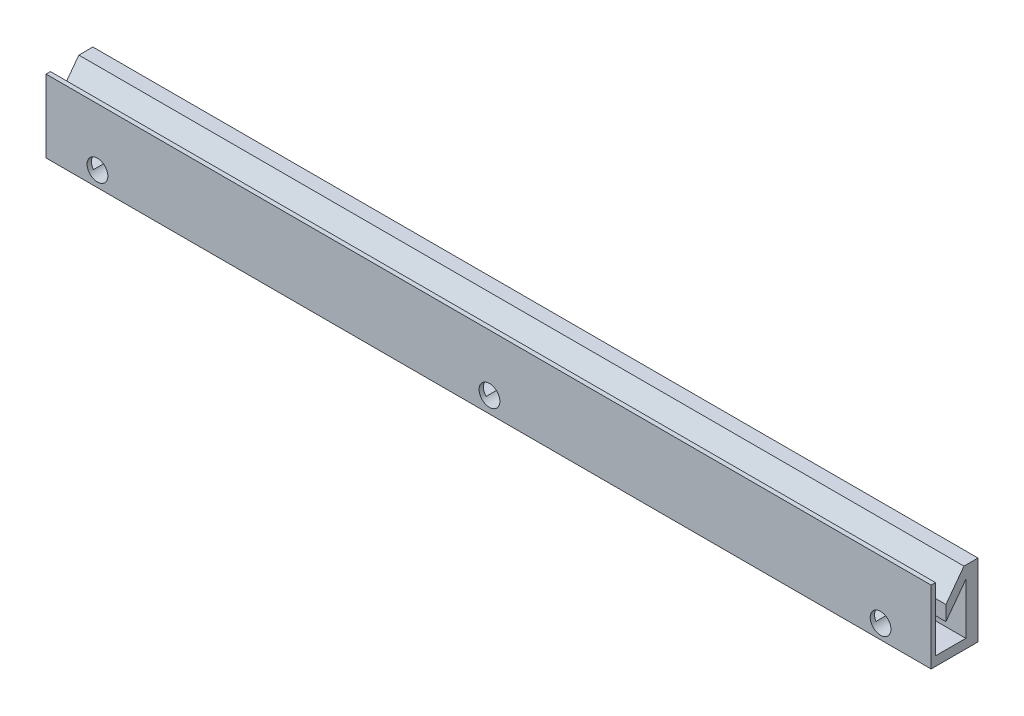
ISO-10303-21;
HEADER;
FILE_DESCRIPTION(('STEP AP214'),'2;1');
FILE_NAME('part.step','',(''),(''),'','','');
FILE_SCHEMA(('AUTOMOTIVE_DESIGN { 1 0 10303 214 1 1 1 1 }'));
ENDSEC;
DATA;
#1=APPLICATION_CONTEXT('core data for automotive mechanical design processes');
#2=APPLICATION_PROTOCOL_DEFINITION('international standard','automotive_design',2000,#1);
#3=PRODUCT_CONTEXT('',#1,'mechanical');
#4=PRODUCT('Part','Part','',(#3));
#5=PRODUCT_RELATED_PRODUCT_CATEGORY('part','',(#4));
#6=PRODUCT_DEFINITION_FORMATION('','',#4);
#7=PRODUCT_DEFINITION_CONTEXT('part definition',#1,'design');
#8=PRODUCT_DEFINITION('design','',#6,#7);
#9=PRODUCT_DEFINITION_SHAPE('','',#8);
#10=(LENGTH_UNIT() NAMED_UNIT(*) SI_UNIT(.MILLI.,.METRE.));
#11=(NAMED_UNIT(*) PLANE_ANGLE_UNIT() SI_UNIT($,.RADIAN.));
#12=(NAMED_UNIT(*) SI_UNIT($,.STERADIAN.) SOLID_ANGLE_UNIT());
#13=UNCERTAINTY_MEASURE_WITH_UNIT(LENGTH_MEASURE(1.E-05),#10,'distance_accuracy_value','');
#14=(GEOMETRIC_REPRESENTATION_CONTEXT(3) GLOBAL_UNCERTAINTY_ASSIGNED_CONTEXT((#13)) GLOBAL_UNIT_ASSIGNED_CONTEXT((#10,
#11,#12)) REPRESENTATION_CONTEXT('',''));
#15=CARTESIAN_POINT('',(0.,0.,0.));
#16=DIRECTION('',(0.,0.,1.));
#17=DIRECTION('',(1.,0.,0.));
#18=AXIS2_PLACEMENT_3D('',#15,#16,#17);
#19=CARTESIAN_POINT('',(203.2,2.48430155846311,-1.08300559873116));
#20=DIRECTION('',(0.,-1.,0.));
#21=DIRECTION('',(0.,0.,-1.));
#22=AXIS2_PLACEMENT_3D('',#19,#20,#21);
#23=PLANE('',#22);
#24=DIRECTION('',(-1.,0.,0.));
#25=VECTOR('',#24,1.);
#26=CARTESIAN_POINT('',(203.2,2.48430155846311,-8.05260115635851));
#27=LINE('',#26,#25);
#28=CARTESIAN_POINT('',(189.522568099684,2.48430155846311,-8.05260115635851));
#29=VERTEX_POINT('',#28);
#30=CARTESIAN_POINT('',(103.581692809099,2.48430155846311,-8.05260115635851));
#31=VERTEX_POINT('',#30);
#32=EDGE_CURVE('E165',#29,#31,#27,.T.);
#33=ORIENTED_EDGE('',*,*,#32,.T.);
#34=DIRECTION('',(0.,0.,1.));
#35=VECTOR('',#34,1.);
#36=CARTESIAN_POINT('',(103.581692809099,2.48430155846311,-10.8439852300734));
#37=LINE('',#36,#35);
#38=CARTESIAN_POINT('',(103.581692809099,2.48430155846311,-1.08300559873116));
#39=VERTEX_POINT('',#38);
#40=EDGE_CURVE('E153',#31,#39,#37,.T.);
#41=ORIENTED_EDGE('',*,*,#40,.T.);
#42=DIRECTION('',(-1.,0.,0.));
#43=VECTOR('',#42,1.);
#44=CARTESIAN_POINT('',(203.2,2.48430155846311,-1.08300559873116));
#45=LINE('',#44,#43);
#46=CARTESIAN_POINT('',(189.522568099684,2.48430155846311,-1.08300559873116));
#47=VERTEX_POINT('',#46);
#48=EDGE_CURVE('E163',#47,#39,#45,.T.);
#49=ORIENTED_EDGE('',*,*,#48,.F.);
#50=DIRECTION('',(0.,0.,1.));
#51=VECTOR('',#50,1.);
#52=CARTESIAN_POINT('',(189.522568099684,2.48430155846311,-10.8439852300734));
#53=LINE('',#52,#51);
#54=EDGE_CURVE('E57',#47,#29,#53,.F.);
#55=ORIENTED_EDGE('',*,*,#54,.T.);
#56=EDGE_LOOP('',(#33,#41,#49,#55));
#57=FACE_BOUND('',#56,.T.);
#58=ADVANCED_FACE('F34',(#57),#23,.F.);
#59=CARTESIAN_POINT('',(203.2,2.48430155846311,-8.05260115635851));
#60=VERTEX_POINT('',#59);
#61=CARTESIAN_POINT('',(193.670130737542,2.48430155846311,-8.05260115635851));
#62=VERTEX_POINT('',#61);
#63=EDGE_CURVE('E326',#60,#62,#27,.T.);
#64=ORIENTED_EDGE('',*,*,#63,.T.);
#65=DIRECTION('',(0.,0.,1.));
#66=VECTOR('',#65,1.);
#67=CARTESIAN_POINT('',(193.670130737542,2.48430155846311,-10.8439852300734));
#68=LINE('',#67,#66);
#69=CARTESIAN_POINT('',(193.670130737542,2.48430155846311,-1.08300559873116));
#70=VERTEX_POINT('',#69);
#71=EDGE_CURVE('E261',#62,#70,#68,.T.);
#72=ORIENTED_EDGE('',*,*,#71,.T.);
#73=CARTESIAN_POINT('',(203.2,2.48430155846311,-1.08300559873116));
#74=VERTEX_POINT('',#73);
#75=EDGE_CURVE('E171',#74,#70,#45,.T.);
#76=ORIENTED_EDGE('',*,*,#75,.F.);
#77=DIRECTION('',(0.,0.,1.));
#78=VECTOR('',#77,1.);
#79=CARTESIAN_POINT('',(203.2,2.48430155846311,-1.08300559873116));
#80=LINE('',#79,#78);
#81=EDGE_CURVE('E226',#60,#74,#80,.T.);
#82=ORIENTED_EDGE('',*,*,#81,.F.);
#83=EDGE_LOOP('',(#64,#72,#76,#82));
#84=FACE_BOUND('',#83,.T.);
#85=ADVANCED_FACE('F324',(#84),#23,.F.);
#86=CARTESIAN_POINT('',(100.039835759607,2.48430155846311,-1.08300559873116));
#87=VERTEX_POINT('',#86);
#88=CARTESIAN_POINT('',(13.7542086647836,2.48430155846311,-1.08300559873116));
#89=VERTEX_POINT('',#88);
#90=EDGE_CURVE('E172',#87,#89,#45,.T.);
#91=ORIENTED_EDGE('',*,*,#90,.F.);
#92=DIRECTION('',(0.,0.,1.));
#93=VECTOR('',#92,1.);
#94=CARTESIAN_POINT('',(100.039835759607,2.48430155846311,-10.8439852300734));
#95=LINE('',#94,#93);
#96=CARTESIAN_POINT('',(100.039835759607,2.48430155846311,-8.05260115635851));
#97=VERTEX_POINT('',#96);
#98=EDGE_CURVE('E49',#87,#97,#95,.F.);
#99=ORIENTED_EDGE('',*,*,#98,.T.);
#100=CARTESIAN_POINT('',(13.7542086647836,2.48430155846311,-8.05260115635851));
#101=VERTEX_POINT('',#100);
#102=EDGE_CURVE('E331',#97,#101,#27,.T.);
#103=ORIENTED_EDGE('',*,*,#102,.T.);
#104=DIRECTION('',(0.,0.,1.));
#105=VECTOR('',#104,1.);
#106=CARTESIAN_POINT('',(13.7542086647836,2.48430155846311,-10.8439852300734));
#107=LINE('',#106,#105);
#108=EDGE_CURVE('E244',#101,#89,#107,.T.);
#109=ORIENTED_EDGE('',*,*,#108,.T.);
#110=EDGE_LOOP('',(#91,#99,#103,#109));
#111=FACE_BOUND('',#110,.T.);
#112=ADVANCED_FACE('F378',(#111),#23,.F.);
#113=CARTESIAN_POINT('',(203.2,0.369350393952135,-10.8439852300734));
#114=DIRECTION('',(0.,1.,0.));
#115=DIRECTION('',(0.,0.,1.));
#116=AXIS2_PLACEMENT_3D('',#113,#114,#115);
#117=PLANE('',#116);
#118=DIRECTION('',(0.,0.,-1.));
#119=VECTOR('',#118,1.);
#120=CARTESIAN_POINT('',(0.,0.369350393952135,-10.8439852300734));
#121=LINE('',#120,#119);
#122=CARTESIAN_POINT('',(0.,0.369350393952133,-0.0830055987311594));
#123=VERTEX_POINT('',#122);
#124=CARTESIAN_POINT('',(0.,0.369350393952135,-10.8439852300734));
#125=VERTEX_POINT('',#124);
#126=EDGE_CURVE('E217',#123,#125,#121,.T.);
#127=ORIENTED_EDGE('',*,*,#126,.T.);
#128=DIRECTION('',(-1.,0.,0.));
#129=VECTOR('',#128,1.);
#130=CARTESIAN_POINT('',(203.2,0.369350393952135,-10.8439852300734));
#131=LINE('',#130,#129);
#132=CARTESIAN_POINT('',(203.2,0.369350393952135,-10.8439852300734));
#133=VERTEX_POINT('',#132);
#134=EDGE_CURVE('E11',#133,#125,#131,.T.);
#135=ORIENTED_EDGE('',*,*,#134,.F.);
#136=DIRECTION('',(0.,0.,-1.));
#137=VECTOR('',#136,1.);
#138=CARTESIAN_POINT('',(203.2,0.369350393952135,-10.8439852300734));
#139=LINE('',#138,#137);
#140=CARTESIAN_POINT('',(203.2,0.369350393952133,-0.0830055987311594));
#141=VERTEX_POINT('',#140);
#142=EDGE_CURVE('E197',#141,#133,#139,.T.);
#143=ORIENTED_EDGE('',*,*,#142,.F.);
#144=DIRECTION('',(-1.,0.,0.));
#145=VECTOR('',#144,1.);
#146=CARTESIAN_POINT('',(203.2,0.369350393952133,-0.0830055987311594));
#147=LINE('',#146,#145);
#148=EDGE_CURVE('E189',#141,#123,#147,.T.);
#149=ORIENTED_EDGE('',*,*,#148,.T.);
#150=EDGE_LOOP('',(#127,#135,#143,#149));
#151=FACE_BOUND('',#150,.T.);
#152=ADVANCED_FACE('F36',(#151),#117,.F.);
#153=CARTESIAN_POINT('',(203.2,17.0566926125378,-10.8439852300734));
#154=DIRECTION('',(0.,0.,1.));
#155=DIRECTION('',(0.,-1.,0.));
#156=AXIS2_PLACEMENT_3D('',#153,#154,#155);
#157=PLANE('',#156);
#158=CARTESIAN_POINT('',(101.810764284353,4.07620724748511,-10.8439852300734));
#159=DIRECTION('',(0.,0.,1.));
#160=DIRECTION('',(1.,0.,0.));
#161=AXIS2_PLACEMENT_3D('',#158,#159,#160);
#162=CIRCLE('',#161,2.38125000000001);
#163=CARTESIAN_POINT('',(104.192014284353,4.07620724748511,-10.8439852300734));
#164=VERTEX_POINT('',#163);
#165=EDGE_CURVE('E158',#164,#164,#162,.T.);
#166=ORIENTED_EDGE('',*,*,#165,.T.);
#167=EDGE_LOOP('',(#166));
#168=FACE_BOUND('',#167,.T.);
#169=CARTESIAN_POINT('',(191.596349418613,3.65467867877966,-10.8439852300734));
#170=DIRECTION('',(0.,0.,1.));
#171=DIRECTION('',(1.,0.,0.));
#172=AXIS2_PLACEMENT_3D('',#169,#170,#171);
#173=CIRCLE('',#172,2.38125000000001);
#174=CARTESIAN_POINT('',(193.977599418613,3.65467867877966,-10.8439852300734));
#175=VERTEX_POINT('',#174);
#176=EDGE_CURVE('E266',#175,#175,#173,.T.);
#177=ORIENTED_EDGE('',*,*,#176,.T.);
#178=EDGE_LOOP('',(#177));
#179=FACE_BOUND('',#178,.T.);
#180=CARTESIAN_POINT('',(11.8144148657399,3.86544296313239,-10.8439852300734));
#181=DIRECTION('',(0.,0.,1.));
#182=DIRECTION('',(1.,0.,0.));
#183=AXIS2_PLACEMENT_3D('',#180,#181,#182);
#184=CIRCLE('',#183,2.38125);
#185=CARTESIAN_POINT('',(14.1956648657399,3.86544296313239,-10.8439852300734));
#186=VERTEX_POINT('',#185);
#187=EDGE_CURVE('E252',#186,#186,#184,.T.);
#188=ORIENTED_EDGE('',*,*,#187,.T.);
#189=EDGE_LOOP('',(#188));
#190=FACE_BOUND('',#189,.T.);
#191=DIRECTION('',(0.,1.,0.));
#192=VECTOR('',#191,1.);
#193=CARTESIAN_POINT('',(0.,17.0566926125378,-10.8439852300734));
#194=LINE('',#193,#192);
#195=CARTESIAN_POINT('',(0.,17.0566926125378,-10.8439852300734));
#196=VERTEX_POINT('',#195);
#197=EDGE_CURVE('E215',#125,#196,#194,.T.);
#198=ORIENTED_EDGE('',*,*,#197,.T.);
#199=DIRECTION('',(-1.,0.,0.));
#200=VECTOR('',#199,1.);
#201=CARTESIAN_POINT('',(203.2,17.0566926125378,-10.8439852300734));
#202=LINE('',#201,#200);
#203=CARTESIAN_POINT('',(203.2,17.0566926125378,-10.8439852300734));
#204=VERTEX_POINT('',#203);
#205=EDGE_CURVE('E42',#204,#196,#202,.T.);
#206=ORIENTED_EDGE('',*,*,#205,.F.);
#207=DIRECTION('',(0.,1.,0.));
#208=VECTOR('',#207,1.);
#209=CARTESIAN_POINT('',(203.2,17.0566926125378,-10.8439852300734));
#210=LINE('',#209,#208);
#211=EDGE_CURVE('E238',#133,#204,#210,.T.);
#212=ORIENTED_EDGE('',*,*,#211,.F.);
#213=ORIENTED_EDGE('',*,*,#134,.T.);
#214=EDGE_LOOP('',(#198,#206,#212,#213));
#215=FACE_BOUND('',#214,.T.);
#216=ADVANCED_FACE('F280',(#168,#179,#190,#215),#157,.F.);
#217=CARTESIAN_POINT('',(203.2,17.0566926125378,-7.62431640094036));
#218=DIRECTION('',(0.,-1.,0.));
#219=DIRECTION('',(0.,0.,-1.));
#220=AXIS2_PLACEMENT_3D('',#217,#218,#219);
#221=PLANE('',#220);
#222=DIRECTION('',(0.,0.,1.));
#223=VECTOR('',#222,1.);
#224=CARTESIAN_POINT('',(0.,17.0566926125378,-7.62431640094036));
#225=LINE('',#224,#223);
#226=CARTESIAN_POINT('',(0.,17.0566926125378,-7.62431640094036));
#227=VERTEX_POINT('',#226);
#228=EDGE_CURVE('E213',#196,#227,#225,.T.);
#229=ORIENTED_EDGE('',*,*,#228,.T.);
#230=DIRECTION('',(-1.,0.,0.));
#231=VECTOR('',#230,1.);
#232=CARTESIAN_POINT('',(203.2,17.0566926125378,-7.62431640094036));
#233=LINE('',#232,#231);
#234=CARTESIAN_POINT('',(203.2,17.0566926125378,-7.62431640094036));
#235=VERTEX_POINT('',#234);
#236=EDGE_CURVE('E352',#235,#227,#233,.T.);
#237=ORIENTED_EDGE('',*,*,#236,.F.);
#238=DIRECTION('',(0.,0.,1.));
#239=VECTOR('',#238,1.);
#240=CARTESIAN_POINT('',(203.2,17.0566926125378,-7.62431640094036));
#241=LINE('',#240,#239);
#242=EDGE_CURVE('E236',#204,#235,#241,.T.);
#243=ORIENTED_EDGE('',*,*,#242,.F.);
#244=ORIENTED_EDGE('',*,*,#205,.T.);
#245=EDGE_LOOP('',(#229,#237,#243,#244));
#246=FACE_BOUND('',#245,.T.);
#247=ADVANCED_FACE('F357',(#246),#221,.F.);
#248=CARTESIAN_POINT('',(203.2,11.4955038209998,-3.48300559873116));
#249=DIRECTION('',(0.,-0.597266145998168,-0.802043110340395));
#250=DIRECTION('',(0.,0.802043110340395,-0.597266145998168));
#251=AXIS2_PLACEMENT_3D('',#248,#249,#250);
#252=PLANE('',#251);
#253=DIRECTION('',(0.,-0.802043110340395,0.597266145998167));
#254=VECTOR('',#253,1.);
#255=CARTESIAN_POINT('',(0.,11.4955038209998,-3.48300559873116));
#256=LINE('',#255,#254);
#257=CARTESIAN_POINT('',(0.,11.4955038209998,-3.48300559873116));
#258=VERTEX_POINT('',#257);
#259=EDGE_CURVE('E211',#227,#258,#256,.T.);
#260=ORIENTED_EDGE('',*,*,#259,.T.);
#261=DIRECTION('',(-1.,0.,0.));
#262=VECTOR('',#261,1.);
#263=CARTESIAN_POINT('',(203.2,11.4955038209998,-3.48300559873116));
#264=LINE('',#263,#262);
#265=CARTESIAN_POINT('',(203.2,11.4955038209998,-3.48300559873116));
#266=VERTEX_POINT('',#265);
#267=EDGE_CURVE('E349',#266,#258,#264,.T.);
#268=ORIENTED_EDGE('',*,*,#267,.F.);
#269=DIRECTION('',(0.,-0.802043110340395,0.597266145998167));
#270=VECTOR('',#269,1.);
#271=CARTESIAN_POINT('',(203.2,11.4955038209998,-3.48300559873116));
#272=LINE('',#271,#270);
#273=EDGE_CURVE('E234',#235,#266,#272,.T.);
#274=ORIENTED_EDGE('',*,*,#273,.F.);
#275=ORIENTED_EDGE('',*,*,#236,.T.);
#276=EDGE_LOOP('',(#260,#268,#274,#275));
#277=FACE_BOUND('',#276,.T.);
#278=ADVANCED_FACE('F362',(#277),#252,.F.);
#279=CARTESIAN_POINT('',(203.2,8.08145593026372,-3.48300559873116));
#280=DIRECTION('',(0.,0.,-1.));
#281=DIRECTION('',(-1.,0.,0.));
#282=AXIS2_PLACEMENT_3D('',#279,#280,#281);
#283=PLANE('',#282);
#284=DIRECTION('',(0.,-1.,0.));
#285=VECTOR('',#284,1.);
#286=CARTESIAN_POINT('',(0.,8.08145593026372,-3.48300559873116));
#287=LINE('',#286,#285);
#288=CARTESIAN_POINT('',(0.,8.08145593026372,-3.48300559873116));
#289=VERTEX_POINT('',#288);
#290=EDGE_CURVE('E209',#258,#289,#287,.T.);
#291=ORIENTED_EDGE('',*,*,#290,.T.);
#292=DIRECTION('',(-1.,0.,0.));
#293=VECTOR('',#292,1.);
#294=CARTESIAN_POINT('',(203.2,8.08145593026372,-3.48300559873116));
#295=LINE('',#294,#293);
#296=CARTESIAN_POINT('',(203.2,8.08145593026372,-3.48300559873116));
#297=VERTEX_POINT('',#296);
#298=EDGE_CURVE('E346',#297,#289,#295,.T.);
#299=ORIENTED_EDGE('',*,*,#298,.F.);
#300=DIRECTION('',(0.,-1.,0.));
#301=VECTOR('',#300,1.);
#302=CARTESIAN_POINT('',(203.2,8.08145593026372,-3.48300559873116));
#303=LINE('',#302,#301);
#304=EDGE_CURVE('E232',#266,#297,#303,.T.);
#305=ORIENTED_EDGE('',*,*,#304,.F.);
#306=ORIENTED_EDGE('',*,*,#267,.T.);
#307=EDGE_LOOP('',(#291,#299,#305,#306));
#308=FACE_BOUND('',#307,.T.);
#309=ADVANCED_FACE('F363',(#308),#283,.F.);
#310=CARTESIAN_POINT('',(203.2,14.2177699647919,-8.05260115635851));
#311=DIRECTION('',(0.,0.597266145998167,0.802043110340395));
#312=DIRECTION('',(0.,-0.802043110340396,0.597266145998167));
#313=AXIS2_PLACEMENT_3D('',#310,#311,#312);
#314=PLANE('',#313);
#315=DIRECTION('',(0.,0.802043110340396,-0.597266145998167));
#316=VECTOR('',#315,1.);
#317=CARTESIAN_POINT('',(0.,14.2177699647919,-8.05260115635851));
#318=LINE('',#317,#316);
#319=CARTESIAN_POINT('',(0.,14.2177699647919,-8.05260115635851));
#320=VERTEX_POINT('',#319);
#321=EDGE_CURVE('E207',#289,#320,#318,.T.);
#322=ORIENTED_EDGE('',*,*,#321,.T.);
#323=DIRECTION('',(-1.,0.,0.));
#324=VECTOR('',#323,1.);
#325=CARTESIAN_POINT('',(203.2,14.2177699647919,-8.05260115635851));
#326=LINE('',#325,#324);
#327=CARTESIAN_POINT('',(203.2,14.2177699647919,-8.05260115635851));
#328=VERTEX_POINT('',#327);
#329=EDGE_CURVE('E332',#328,#320,#326,.T.);
#330=ORIENTED_EDGE('',*,*,#329,.F.);
#331=DIRECTION('',(0.,0.802043110340396,-0.597266145998167));
#332=VECTOR('',#331,1.);
#333=CARTESIAN_POINT('',(203.2,14.2177699647919,-8.05260115635851));
#334=LINE('',#333,#332);
#335=EDGE_CURVE('E230',#297,#328,#334,.T.);
#336=ORIENTED_EDGE('',*,*,#335,.F.);
#337=ORIENTED_EDGE('',*,*,#298,.T.);
#338=EDGE_LOOP('',(#322,#330,#336,#337));
#339=FACE_BOUND('',#338,.T.);
#340=ADVANCED_FACE('F343',(#339),#314,.F.);
#341=CARTESIAN_POINT('',(203.2,2.48430155846311,-8.05260115635851));
#342=DIRECTION('',(0.,0.,-1.));
#343=DIRECTION('',(-1.,0.,0.));
#344=AXIS2_PLACEMENT_3D('',#341,#342,#343);
#345=PLANE('',#344);
#346=ORIENTED_EDGE('',*,*,#102,.F.);
#347=CARTESIAN_POINT('',(101.810764284353,4.07620724748511,-8.05260115635851));
#348=DIRECTION('',(0.,0.,-1.));
#349=DIRECTION('',(-1.,0.,0.));
#350=AXIS2_PLACEMENT_3D('',#347,#348,#349);
#351=CIRCLE('',#350,2.38125000000001);
#352=EDGE_CURVE('E166',#97,#31,#351,.T.);
#353=ORIENTED_EDGE('',*,*,#352,.T.);
#354=ORIENTED_EDGE('',*,*,#32,.F.);
#355=CARTESIAN_POINT('',(191.596349418613,3.65467867877966,-8.05260115635851));
#356=DIRECTION('',(0.,0.,-1.));
#357=DIRECTION('',(-1.,0.,0.));
#358=AXIS2_PLACEMENT_3D('',#355,#356,#357);
#359=CIRCLE('',#358,2.38125000000001);
#360=EDGE_CURVE('E256',#29,#62,#359,.T.);
#361=ORIENTED_EDGE('',*,*,#360,.T.);
#362=ORIENTED_EDGE('',*,*,#63,.F.);
#363=DIRECTION('',(0.,-1.,0.));
#364=VECTOR('',#363,1.);
#365=CARTESIAN_POINT('',(203.2,2.48430155846311,-8.05260115635851));
#366=LINE('',#365,#364);
#367=EDGE_CURVE('E228',#328,#60,#366,.T.);
#368=ORIENTED_EDGE('',*,*,#367,.F.);
#369=ORIENTED_EDGE('',*,*,#329,.T.);
#370=DIRECTION('',(0.,-1.,0.));
#371=VECTOR('',#370,1.);
#372=CARTESIAN_POINT('',(0.,2.48430155846311,-8.05260115635851));
#373=LINE('',#372,#371);
#374=CARTESIAN_POINT('',(0.,2.48430155846311,-8.05260115635851));
#375=VERTEX_POINT('',#374);
#376=EDGE_CURVE('E204',#320,#375,#373,.T.);
#377=ORIENTED_EDGE('',*,*,#376,.T.);
#378=CARTESIAN_POINT('',(9.87462106669626,2.48430155846311,-8.05260115635851));
#379=VERTEX_POINT('',#378);
#380=EDGE_CURVE('E175',#379,#375,#27,.T.);
#381=ORIENTED_EDGE('',*,*,#380,.F.);
#382=CARTESIAN_POINT('',(11.8144148657399,3.86544296313239,-8.05260115635851));
#383=DIRECTION('',(0.,0.,-1.));
#384=DIRECTION('',(-1.,0.,0.));
#385=AXIS2_PLACEMENT_3D('',#382,#383,#384);
#386=CIRCLE('',#385,2.38125);
#387=EDGE_CURVE('E220',#379,#101,#386,.T.);
#388=ORIENTED_EDGE('',*,*,#387,.T.);
#389=EDGE_LOOP('',(#346,#353,#354,#361,#362,#368,#369,#377,#381,#388));
#390=FACE_BOUND('',#389,.T.);
#391=ADVANCED_FACE('F329',(#390),#345,.F.);
#392=CARTESIAN_POINT('',(9.87462106669626,2.48430155846311,-1.08300559873116));
#393=VERTEX_POINT('',#392);
#394=CARTESIAN_POINT('',(0.,2.48430155846311,-1.08300559873116));
#395=VERTEX_POINT('',#394);
#396=EDGE_CURVE('E174',#393,#395,#45,.T.);
#397=ORIENTED_EDGE('',*,*,#396,.F.);
#398=DIRECTION('',(0.,0.,1.));
#399=VECTOR('',#398,1.);
#400=CARTESIAN_POINT('',(9.87462106669626,2.48430155846311,-10.8439852300734));
#401=LINE('',#400,#399);
#402=EDGE_CURVE('E247',#393,#379,#401,.F.);
#403=ORIENTED_EDGE('',*,*,#402,.T.);
#404=ORIENTED_EDGE('',*,*,#380,.T.);
#405=DIRECTION('',(0.,0.,1.));
#406=VECTOR('',#405,1.);
#407=CARTESIAN_POINT('',(0.,2.48430155846311,-1.08300559873116));
#408=LINE('',#407,#406);
#409=EDGE_CURVE('E202',#375,#395,#408,.T.);
#410=ORIENTED_EDGE('',*,*,#409,.T.);
#411=EDGE_LOOP('',(#397,#403,#404,#410));
#412=FACE_BOUND('',#411,.T.);
#413=ADVANCED_FACE('F336',(#412),#23,.F.);
#414=CARTESIAN_POINT('',(203.2,17.0566926125378,-1.08300559873116));
#415=DIRECTION('',(0.,0.,1.));
#416=DIRECTION('',(0.,-1.,0.));
#417=AXIS2_PLACEMENT_3D('',#414,#415,#416);
#418=PLANE('',#417);
#419=ORIENTED_EDGE('',*,*,#48,.T.);
#420=CARTESIAN_POINT('',(101.810764284353,4.07620724748511,-1.08300559873116));
#421=DIRECTION('',(0.,0.,1.));
#422=DIRECTION('',(0.,-1.,0.));
#423=AXIS2_PLACEMENT_3D('',#420,#421,#422);
#424=CIRCLE('',#423,2.38125000000001);
#425=EDGE_CURVE('E150',#39,#87,#424,.T.);
#426=ORIENTED_EDGE('',*,*,#425,.T.);
#427=ORIENTED_EDGE('',*,*,#90,.T.);
#428=CARTESIAN_POINT('',(11.8144148657399,3.86544296313239,-1.08300559873116));
#429=DIRECTION('',(0.,0.,1.));
#430=DIRECTION('',(0.,-1.,0.));
#431=AXIS2_PLACEMENT_3D('',#428,#429,#430);
#432=CIRCLE('',#431,2.38125);
#433=EDGE_CURVE('E250',#89,#393,#432,.T.);
#434=ORIENTED_EDGE('',*,*,#433,.T.);
#435=ORIENTED_EDGE('',*,*,#396,.T.);
#436=DIRECTION('',(0.,1.,0.));
#437=VECTOR('',#436,1.);
#438=CARTESIAN_POINT('',(0.,17.0566926125378,-1.08300559873116));
#439=LINE('',#438,#437);
#440=CARTESIAN_POINT('',(0.,17.0566926125378,-1.08300559873116));
#441=VERTEX_POINT('',#440);
#442=EDGE_CURVE('E200',#395,#441,#439,.T.);
#443=ORIENTED_EDGE('',*,*,#442,.T.);
#444=DIRECTION('',(-1.,0.,0.));
#445=VECTOR('',#444,1.);
#446=CARTESIAN_POINT('',(203.2,17.0566926125378,-1.08300559873116));
#447=LINE('',#446,#445);
#448=CARTESIAN_POINT('',(203.2,17.0566926125378,-1.08300559873116));
#449=VERTEX_POINT('',#448);
#450=EDGE_CURVE('E178',#449,#441,#447,.T.);
#451=ORIENTED_EDGE('',*,*,#450,.F.);
#452=DIRECTION('',(0.,1.,0.));
#453=VECTOR('',#452,1.);
#454=CARTESIAN_POINT('',(203.2,17.0566926125378,-1.08300559873116));
#455=LINE('',#454,#453);
#456=EDGE_CURVE('E224',#74,#449,#455,.T.);
#457=ORIENTED_EDGE('',*,*,#456,.F.);
#458=ORIENTED_EDGE('',*,*,#75,.T.);
#459=CARTESIAN_POINT('',(191.596349418613,3.65467867877966,-1.08300559873116));
#460=DIRECTION('',(0.,0.,1.));
#461=DIRECTION('',(0.,-1.,0.));
#462=AXIS2_PLACEMENT_3D('',#459,#460,#461);
#463=CIRCLE('',#462,2.38125000000001);
#464=EDGE_CURVE('E170',#70,#47,#463,.T.);
#465=ORIENTED_EDGE('',*,*,#464,.T.);
#466=EDGE_LOOP('',(#419,#426,#427,#434,#435,#443,#451,#457,#458,#465));
#467=FACE_BOUND('',#466,.T.);
#468=ADVANCED_FACE('F168',(#467),#418,.F.);
#469=CARTESIAN_POINT('',(203.2,17.0566926125378,-0.0830055987311594));
#470=DIRECTION('',(0.,-1.,0.));
#471=DIRECTION('',(0.,0.,-1.));
#472=AXIS2_PLACEMENT_3D('',#469,#470,#471);
#473=PLANE('',#472);
#474=DIRECTION('',(0.,0.,1.));
#475=VECTOR('',#474,1.);
#476=CARTESIAN_POINT('',(0.,17.0566926125378,-0.0830055987311594));
#477=LINE('',#476,#475);
#478=CARTESIAN_POINT('',(0.,17.0566926125378,-0.0830055987311594));
#479=VERTEX_POINT('',#478);
#480=EDGE_CURVE('E198',#441,#479,#477,.T.);
#481=ORIENTED_EDGE('',*,*,#480,.T.);
#482=DIRECTION('',(-1.,0.,0.));
#483=VECTOR('',#482,1.);
#484=CARTESIAN_POINT('',(203.2,17.0566926125378,-0.0830055987311594));
#485=LINE('',#484,#483);
#486=CARTESIAN_POINT('',(203.2,17.0566926125378,-0.0830055987311594));
#487=VERTEX_POINT('',#486);
#488=EDGE_CURVE('E183',#487,#479,#485,.T.);
#489=ORIENTED_EDGE('',*,*,#488,.F.);
#490=DIRECTION('',(0.,0.,1.));
#491=VECTOR('',#490,1.);
#492=CARTESIAN_POINT('',(203.2,17.0566926125378,-0.0830055987311594));
#493=LINE('',#492,#491);
#494=EDGE_CURVE('E222',#449,#487,#493,.T.);
#495=ORIENTED_EDGE('',*,*,#494,.F.);
#496=ORIENTED_EDGE('',*,*,#450,.T.);
#497=EDGE_LOOP('',(#481,#489,#495,#496));
#498=FACE_BOUND('',#497,.T.);
#499=ADVANCED_FACE('F293',(#498),#473,.F.);
#500=CARTESIAN_POINT('',(203.2,0.369350393952133,-0.0830055987311594));
#501=DIRECTION('',(0.,0.,-1.));
#502=DIRECTION('',(-1.,0.,0.));
#503=AXIS2_PLACEMENT_3D('',#500,#501,#502);
#504=PLANE('',#503);
#505=CARTESIAN_POINT('',(101.810764284353,4.07620724748511,-0.0830055987311594));
#506=DIRECTION('',(0.,0.,1.));
#507=DIRECTION('',(1.,0.,0.));
#508=AXIS2_PLACEMENT_3D('',#505,#506,#507);
#509=CIRCLE('',#508,2.38125000000001);
#510=CARTESIAN_POINT('',(104.192014284353,4.07620724748511,-0.0830055987311594));
#511=VERTEX_POINT('',#510);
#512=EDGE_CURVE('E274',#511,#511,#509,.T.);
#513=ORIENTED_EDGE('',*,*,#512,.F.);
#514=EDGE_LOOP('',(#513));
#515=FACE_BOUND('',#514,.T.);
#516=CARTESIAN_POINT('',(191.596349418613,3.65467867877966,-0.0830055987311594));
#517=DIRECTION('',(0.,0.,1.));
#518=DIRECTION('',(1.,0.,0.));
#519=AXIS2_PLACEMENT_3D('',#516,#517,#518);
#520=CIRCLE('',#519,2.38125000000001);
#521=CARTESIAN_POINT('',(193.977599418613,3.65467867877966,-0.0830055987311594));
#522=VERTEX_POINT('',#521);
#523=EDGE_CURVE('E267',#522,#522,#520,.T.);
#524=ORIENTED_EDGE('',*,*,#523,.F.);
#525=EDGE_LOOP('',(#524));
#526=FACE_BOUND('',#525,.T.);
#527=CARTESIAN_POINT('',(11.8144148657399,3.86544296313239,-0.0830055987311594));
#528=DIRECTION('',(0.,0.,1.));
#529=DIRECTION('',(1.,0.,0.));
#530=AXIS2_PLACEMENT_3D('',#527,#528,#529);
#531=CIRCLE('',#530,2.38125);
#532=CARTESIAN_POINT('',(14.1956648657399,3.86544296313239,-0.0830055987311594));
#533=VERTEX_POINT('',#532);
#534=EDGE_CURVE('E253',#533,#533,#531,.T.);
#535=ORIENTED_EDGE('',*,*,#534,.F.);
#536=EDGE_LOOP('',(#535));
#537=FACE_BOUND('',#536,.T.);
#538=DIRECTION('',(0.,-1.,0.));
#539=VECTOR('',#538,1.);
#540=CARTESIAN_POINT('',(0.,0.369350393952133,-0.0830055987311594));
#541=LINE('',#540,#539);
#542=EDGE_CURVE('E195',#479,#123,#541,.T.);
#543=ORIENTED_EDGE('',*,*,#542,.T.);
#544=ORIENTED_EDGE('',*,*,#148,.F.);
#545=DIRECTION('',(0.,-1.,0.));
#546=VECTOR('',#545,1.);
#547=CARTESIAN_POINT('',(203.2,0.369350393952133,-0.0830055987311594));
#548=LINE('',#547,#546);
#549=EDGE_CURVE('E194',#487,#141,#548,.T.);
#550=ORIENTED_EDGE('',*,*,#549,.F.);
#551=ORIENTED_EDGE('',*,*,#488,.T.);
#552=EDGE_LOOP('',(#543,#544,#550,#551));
#553=FACE_BOUND('',#552,.T.);
#554=ADVANCED_FACE('F289',(#515,#526,#537,#553),#504,.F.);
#555=CARTESIAN_POINT('',(203.2,0.,0.));
#556=DIRECTION('',(-1.,0.,0.));
#557=DIRECTION('',(0.,0.,1.));
#558=AXIS2_PLACEMENT_3D('',#555,#556,#557);
#559=PLANE('',#558);
#560=ORIENTED_EDGE('',*,*,#142,.T.);
#561=ORIENTED_EDGE('',*,*,#211,.T.);
#562=ORIENTED_EDGE('',*,*,#242,.T.);
#563=ORIENTED_EDGE('',*,*,#273,.T.);
#564=ORIENTED_EDGE('',*,*,#304,.T.);
#565=ORIENTED_EDGE('',*,*,#335,.T.);
#566=ORIENTED_EDGE('',*,*,#367,.T.);
#567=ORIENTED_EDGE('',*,*,#81,.T.);
#568=ORIENTED_EDGE('',*,*,#456,.T.);
#569=ORIENTED_EDGE('',*,*,#494,.T.);
#570=ORIENTED_EDGE('',*,*,#549,.T.);
#571=EDGE_LOOP('',(#560,#561,#562,#563,#564,#565,#566,#567,#568,#569,#570));
#572=FACE_BOUND('',#571,.T.);
#573=ADVANCED_FACE('F292',(#572),#559,.F.);
#574=CARTESIAN_POINT('',(0.,0.,0.));
#575=DIRECTION('',(-1.,0.,0.));
#576=DIRECTION('',(0.,0.,1.));
#577=AXIS2_PLACEMENT_3D('',#574,#575,#576);
#578=PLANE('',#577);
#579=ORIENTED_EDGE('',*,*,#126,.F.);
#580=ORIENTED_EDGE('',*,*,#542,.F.);
#581=ORIENTED_EDGE('',*,*,#480,.F.);
#582=ORIENTED_EDGE('',*,*,#442,.F.);
#583=ORIENTED_EDGE('',*,*,#409,.F.);
#584=ORIENTED_EDGE('',*,*,#376,.F.);
#585=ORIENTED_EDGE('',*,*,#321,.F.);
#586=ORIENTED_EDGE('',*,*,#290,.F.);
#587=ORIENTED_EDGE('',*,*,#259,.F.);
#588=ORIENTED_EDGE('',*,*,#228,.F.);
#589=ORIENTED_EDGE('',*,*,#197,.F.);
#590=EDGE_LOOP('',(#579,#580,#581,#582,#583,#584,#585,#586,#587,#588,#589));
#591=FACE_BOUND('',#590,.T.);
#592=ADVANCED_FACE('F308',(#591),#578,.T.);
#593=CARTESIAN_POINT('',(11.8144148657399,3.86544296313239,-10.8439852300734));
#594=DIRECTION('',(0.,0.,1.));
#595=DIRECTION('',(1.,0.,0.));
#596=AXIS2_PLACEMENT_3D('',#593,#594,#595);
#597=CYLINDRICAL_SURFACE('',#596,2.38125);
#598=ORIENTED_EDGE('',*,*,#187,.F.);
#599=EDGE_LOOP('',(#598));
#600=FACE_BOUND('',#599,.T.);
#601=ORIENTED_EDGE('',*,*,#534,.T.);
#602=EDGE_LOOP('',(#601));
#603=FACE_BOUND('',#602,.T.);
#604=ORIENTED_EDGE('',*,*,#402,.F.);
#605=ORIENTED_EDGE('',*,*,#433,.F.);
#606=ORIENTED_EDGE('',*,*,#108,.F.);
#607=ORIENTED_EDGE('',*,*,#387,.F.);
#608=EDGE_LOOP('',(#604,#605,#606,#607));
#609=FACE_BOUND('',#608,.T.);
#610=ADVANCED_FACE('F395',(#600,#603,#609),#597,.F.);
#611=CARTESIAN_POINT('',(191.596349418613,3.65467867877966,-10.8439852300734));
#612=DIRECTION('',(0.,0.,1.));
#613=DIRECTION('',(1.,0.,0.));
#614=AXIS2_PLACEMENT_3D('',#611,#612,#613);
#615=CYLINDRICAL_SURFACE('',#614,2.38125000000001);
#616=ORIENTED_EDGE('',*,*,#176,.F.);
#617=EDGE_LOOP('',(#616));
#618=FACE_BOUND('',#617,.T.);
#619=ORIENTED_EDGE('',*,*,#523,.T.);
#620=EDGE_LOOP('',(#619));
#621=FACE_BOUND('',#620,.T.);
#622=ORIENTED_EDGE('',*,*,#54,.F.);
#623=ORIENTED_EDGE('',*,*,#464,.F.);
#624=ORIENTED_EDGE('',*,*,#71,.F.);
#625=ORIENTED_EDGE('',*,*,#360,.F.);
#626=EDGE_LOOP('',(#622,#623,#624,#625));
#627=FACE_BOUND('',#626,.T.);
#628=ADVANCED_FACE('F285',(#618,#621,#627),#615,.F.);
#629=CARTESIAN_POINT('',(101.810764284353,4.07620724748511,-10.8439852300734));
#630=DIRECTION('',(0.,0.,1.));
#631=DIRECTION('',(1.,0.,0.));
#632=AXIS2_PLACEMENT_3D('',#629,#630,#631);
#633=CYLINDRICAL_SURFACE('',#632,2.38125000000001);
#634=ORIENTED_EDGE('',*,*,#165,.F.);
#635=EDGE_LOOP('',(#634));
#636=FACE_BOUND('',#635,.T.);
#637=ORIENTED_EDGE('',*,*,#512,.T.);
#638=EDGE_LOOP('',(#637));
#639=FACE_BOUND('',#638,.T.);
#640=ORIENTED_EDGE('',*,*,#98,.F.);
#641=ORIENTED_EDGE('',*,*,#425,.F.);
#642=ORIENTED_EDGE('',*,*,#40,.F.);
#643=ORIENTED_EDGE('',*,*,#352,.F.);
#644=EDGE_LOOP('',(#640,#641,#642,#643));
#645=FACE_BOUND('',#644,.T.);
#646=ADVANCED_FACE('F152',(#636,#639,#645),#633,.F.);
#647=CLOSED_SHELL('',(#58,#85,#112,#152,#216,#247,#278,#309,#340,#391,#413,#468,#499,#554,#573,
#592,#610,#628,#646));
#648=MANIFOLD_SOLID_BREP('B2',#647);
#649=ADVANCED_BREP_SHAPE_REPRESENTATION('',(#18,#648),#14);
#650=SHAPE_DEFINITION_REPRESENTATION(#9,#649);
ENDSEC;
END-ISO-10303-21;
